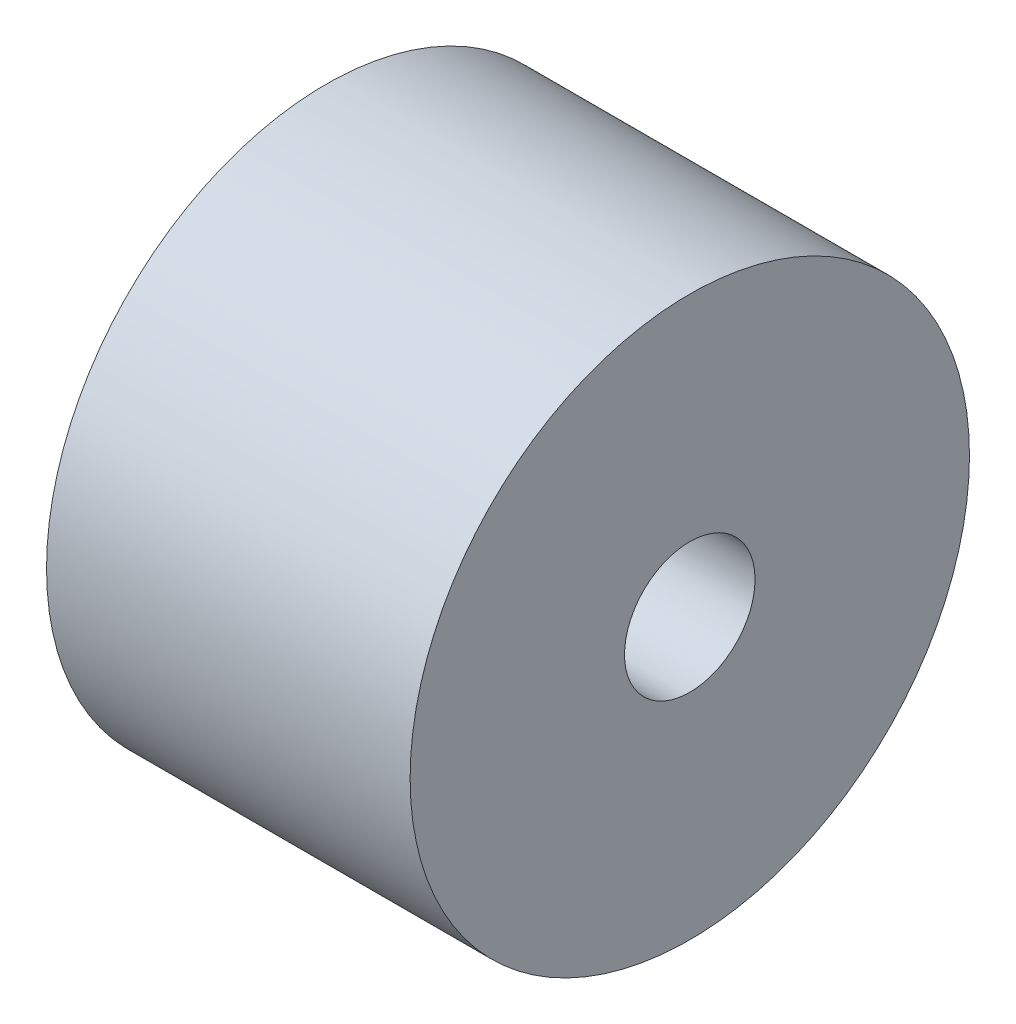
ISO-10303-21;
HEADER;
FILE_DESCRIPTION(('STEP AP214'),'2;1');
FILE_NAME('part.step','',(''),(''),'','','');
FILE_SCHEMA(('AUTOMOTIVE_DESIGN { 1 0 10303 214 1 1 1 1 }'));
ENDSEC;
DATA;
#1=APPLICATION_CONTEXT('core data for automotive mechanical design processes');
#2=APPLICATION_PROTOCOL_DEFINITION('international standard','automotive_design',2000,#1);
#3=PRODUCT_CONTEXT('',#1,'mechanical');
#4=PRODUCT('Part','Part','',(#3));
#5=PRODUCT_RELATED_PRODUCT_CATEGORY('part','',(#4));
#6=PRODUCT_DEFINITION_FORMATION('','',#4);
#7=PRODUCT_DEFINITION_CONTEXT('part definition',#1,'design');
#8=PRODUCT_DEFINITION('design','',#6,#7);
#9=PRODUCT_DEFINITION_SHAPE('','',#8);
#10=(LENGTH_UNIT() NAMED_UNIT(*) SI_UNIT(.MILLI.,.METRE.));
#11=(NAMED_UNIT(*) PLANE_ANGLE_UNIT() SI_UNIT($,.RADIAN.));
#12=(NAMED_UNIT(*) SI_UNIT($,.STERADIAN.) SOLID_ANGLE_UNIT());
#13=UNCERTAINTY_MEASURE_WITH_UNIT(LENGTH_MEASURE(1.E-05),#10,'distance_accuracy_value','');
#14=(GEOMETRIC_REPRESENTATION_CONTEXT(3) GLOBAL_UNCERTAINTY_ASSIGNED_CONTEXT((#13)) GLOBAL_UNIT_ASSIGNED_CONTEXT((#10,
#11,#12)) REPRESENTATION_CONTEXT('',''));
#15=CARTESIAN_POINT('',(0.,0.,0.));
#16=DIRECTION('',(0.,0.,1.));
#17=DIRECTION('',(1.,0.,0.));
#18=AXIS2_PLACEMENT_3D('',#15,#16,#17);
#19=CARTESIAN_POINT('',(11.7,0.,0.));
#20=DIRECTION('',(1.,0.,0.));
#21=DIRECTION('',(0.,0.,-1.));
#22=AXIS2_PLACEMENT_3D('',#19,#20,#21);
#23=PLANE('',#22);
#24=CARTESIAN_POINT('',(11.7,0.,0.));
#25=DIRECTION('',(1.,0.,0.));
#26=DIRECTION('',(0.,0.,-1.));
#27=AXIS2_PLACEMENT_3D('',#24,#25,#26);
#28=CIRCLE('',#27,9.);
#29=CARTESIAN_POINT('',(11.7,0.,-9.));
#30=VERTEX_POINT('',#29);
#31=EDGE_CURVE('E10',#30,#30,#28,.T.);
#32=ORIENTED_EDGE('',*,*,#31,.T.);
#33=EDGE_LOOP('',(#32));
#34=FACE_BOUND('',#33,.T.);
#35=CARTESIAN_POINT('',(11.7,0.,0.));
#36=DIRECTION('',(1.,0.,0.));
#37=DIRECTION('',(0.,0.,-1.));
#38=AXIS2_PLACEMENT_3D('',#35,#36,#37);
#39=CIRCLE('',#38,2.1);
#40=CARTESIAN_POINT('',(11.7,0.,-2.1));
#41=VERTEX_POINT('',#40);
#42=EDGE_CURVE('E46',#41,#41,#39,.T.);
#43=ORIENTED_EDGE('',*,*,#42,.F.);
#44=EDGE_LOOP('',(#43));
#45=FACE_BOUND('',#44,.T.);
#46=ADVANCED_FACE('F35',(#34,#45),#23,.T.);
#47=CARTESIAN_POINT('',(0.,0.,0.));
#48=DIRECTION('',(1.,0.,0.));
#49=DIRECTION('',(0.,0.,-1.));
#50=AXIS2_PLACEMENT_3D('',#47,#48,#49);
#51=PLANE('',#50);
#52=CARTESIAN_POINT('',(0.,0.,0.));
#53=DIRECTION('',(1.,0.,0.));
#54=DIRECTION('',(0.,0.,-1.));
#55=AXIS2_PLACEMENT_3D('',#52,#53,#54);
#56=CIRCLE('',#55,9.);
#57=CARTESIAN_POINT('',(0.,0.,-9.));
#58=VERTEX_POINT('',#57);
#59=EDGE_CURVE('E39',#58,#58,#56,.T.);
#60=ORIENTED_EDGE('',*,*,#59,.F.);
#61=EDGE_LOOP('',(#60));
#62=FACE_BOUND('',#61,.T.);
#63=CARTESIAN_POINT('',(0.,0.,0.));
#64=DIRECTION('',(1.,0.,0.));
#65=DIRECTION('',(0.,0.,-1.));
#66=AXIS2_PLACEMENT_3D('',#63,#64,#65);
#67=CIRCLE('',#66,2.1);
#68=CARTESIAN_POINT('',(0.,0.,-2.1));
#69=VERTEX_POINT('',#68);
#70=EDGE_CURVE('E48',#69,#69,#67,.T.);
#71=ORIENTED_EDGE('',*,*,#70,.T.);
#72=EDGE_LOOP('',(#71));
#73=FACE_BOUND('',#72,.T.);
#74=ADVANCED_FACE('F58',(#62,#73),#51,.F.);
#75=CARTESIAN_POINT('',(11.7,0.,0.));
#76=DIRECTION('',(-1.,0.,0.));
#77=DIRECTION('',(0.,0.,1.));
#78=AXIS2_PLACEMENT_3D('',#75,#76,#77);
#79=CYLINDRICAL_SURFACE('',#78,9.);
#80=ORIENTED_EDGE('',*,*,#31,.F.);
#81=EDGE_LOOP('',(#80));
#82=FACE_BOUND('',#81,.T.);
#83=ORIENTED_EDGE('',*,*,#59,.T.);
#84=EDGE_LOOP('',(#83));
#85=FACE_BOUND('',#84,.T.);
#86=ADVANCED_FACE('F37',(#82,#85),#79,.T.);
#87=CARTESIAN_POINT('',(11.7,0.,0.));
#88=DIRECTION('',(-1.,0.,0.));
#89=DIRECTION('',(0.,0.,1.));
#90=AXIS2_PLACEMENT_3D('',#87,#88,#89);
#91=CYLINDRICAL_SURFACE('',#90,2.1);
#92=ORIENTED_EDGE('',*,*,#42,.T.);
#93=EDGE_LOOP('',(#92));
#94=FACE_BOUND('',#93,.T.);
#95=ORIENTED_EDGE('',*,*,#70,.F.);
#96=EDGE_LOOP('',(#95));
#97=FACE_BOUND('',#96,.T.);
#98=ADVANCED_FACE('F54',(#94,#97),#91,.F.);
#99=CLOSED_SHELL('',(#46,#74,#86,#98));
#100=MANIFOLD_SOLID_BREP('B2',#99);
#101=ADVANCED_BREP_SHAPE_REPRESENTATION('',(#18,#100),#14);
#102=SHAPE_DEFINITION_REPRESENTATION(#9,#101);
ENDSEC;
END-ISO-10303-21;
